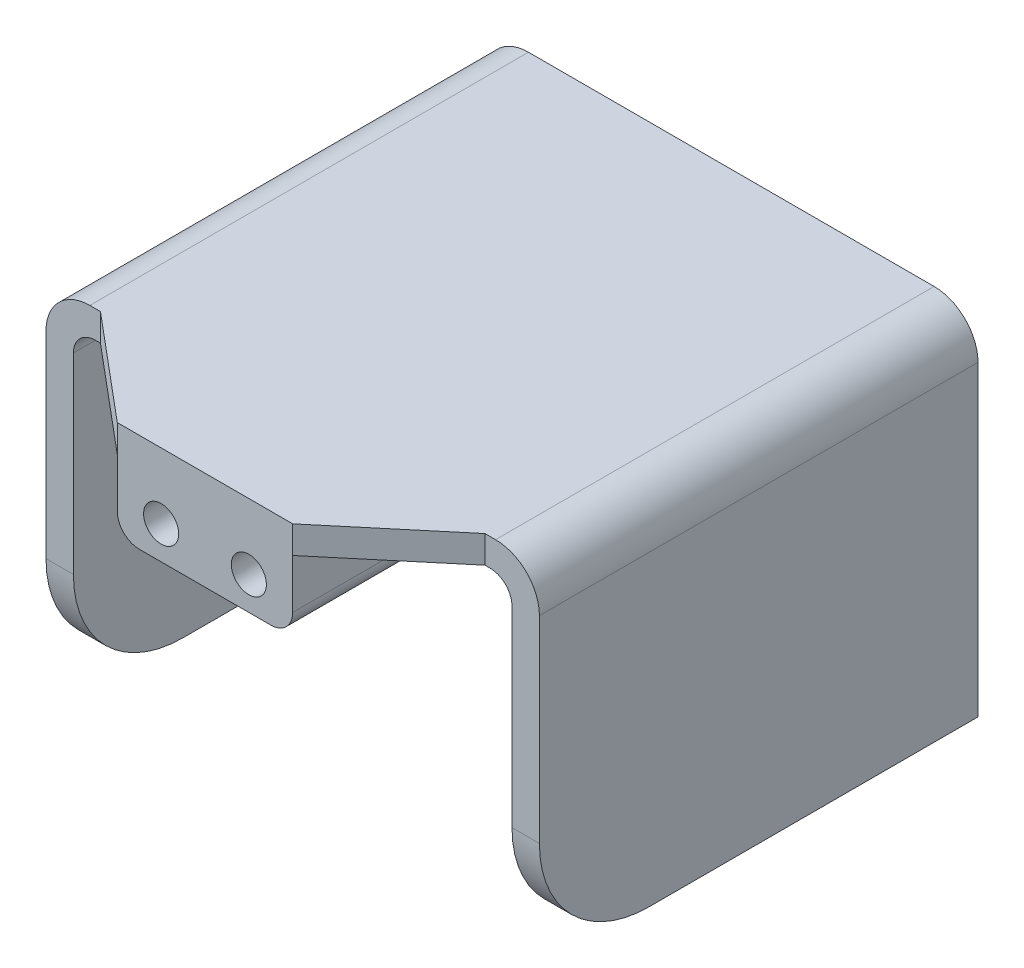
ISO-10303-21;
HEADER;
FILE_DESCRIPTION(('STEP AP214'),'2;1');
FILE_NAME('part.step','',(''),(''),'','','');
FILE_SCHEMA(('AUTOMOTIVE_DESIGN { 1 0 10303 214 1 1 1 1 }'));
ENDSEC;
DATA;
#1=APPLICATION_CONTEXT('core data for automotive mechanical design processes');
#2=APPLICATION_PROTOCOL_DEFINITION('international standard','automotive_design',2000,#1);
#3=PRODUCT_CONTEXT('',#1,'mechanical');
#4=PRODUCT('Part','Part','',(#3));
#5=PRODUCT_RELATED_PRODUCT_CATEGORY('part','',(#4));
#6=PRODUCT_DEFINITION_FORMATION('','',#4);
#7=PRODUCT_DEFINITION_CONTEXT('part definition',#1,'design');
#8=PRODUCT_DEFINITION('design','',#6,#7);
#9=PRODUCT_DEFINITION_SHAPE('','',#8);
#10=(LENGTH_UNIT() NAMED_UNIT(*) SI_UNIT(.MILLI.,.METRE.));
#11=(NAMED_UNIT(*) PLANE_ANGLE_UNIT() SI_UNIT($,.RADIAN.));
#12=(NAMED_UNIT(*) SI_UNIT($,.STERADIAN.) SOLID_ANGLE_UNIT());
#13=UNCERTAINTY_MEASURE_WITH_UNIT(LENGTH_MEASURE(1.E-05),#10,'distance_accuracy_value','');
#14=(GEOMETRIC_REPRESENTATION_CONTEXT(3) GLOBAL_UNCERTAINTY_ASSIGNED_CONTEXT((#13)) GLOBAL_UNIT_ASSIGNED_CONTEXT((#10,
#11,#12)) REPRESENTATION_CONTEXT('',''));
#15=CARTESIAN_POINT('',(0.,0.,0.));
#16=DIRECTION('',(0.,0.,1.));
#17=DIRECTION('',(1.,0.,0.));
#18=AXIS2_PLACEMENT_3D('',#15,#16,#17);
#19=CARTESIAN_POINT('',(-46.25,50.,0.));
#20=DIRECTION('',(0.,0.,1.));
#21=DIRECTION('',(1.,0.,0.));
#22=AXIS2_PLACEMENT_3D('',#19,#20,#21);
#23=PLANE('',#22);
#24=DIRECTION('',(1.,0.,0.));
#25=VECTOR('',#24,1.);
#26=CARTESIAN_POINT('',(50.,-20.,0.));
#27=LINE('',#26,#25);
#28=CARTESIAN_POINT('',(3.12499999999999,-20.,0.));
#29=VERTEX_POINT('',#28);
#30=CARTESIAN_POINT('',(56.25,-20.,0.));
#31=VERTEX_POINT('',#30);
#32=EDGE_CURVE('E218',#29,#31,#27,.T.);
#33=ORIENTED_EDGE('',*,*,#32,.F.);
#34=DIRECTION('',(0.,-1.,0.));
#35=VECTOR('',#34,1.);
#36=CARTESIAN_POINT('',(3.125,60.,0.));
#37=LINE('',#36,#35);
#38=CARTESIAN_POINT('',(3.125,60.,0.));
#39=VERTEX_POINT('',#38);
#40=EDGE_CURVE('E221',#39,#29,#37,.T.);
#41=ORIENTED_EDGE('',*,*,#40,.F.);
#42=DIRECTION('',(-1.,0.,0.));
#43=VECTOR('',#42,1.);
#44=CARTESIAN_POINT('',(46.25,60.,0.));
#45=LINE('',#44,#43);
#46=CARTESIAN_POINT('',(46.25,60.,0.));
#47=VERTEX_POINT('',#46);
#48=EDGE_CURVE('E352',#47,#39,#45,.T.);
#49=ORIENTED_EDGE('',*,*,#48,.F.);
#50=CARTESIAN_POINT('',(46.25,50.,0.));
#51=DIRECTION('',(0.,0.,1.));
#52=DIRECTION('',(-1.,0.,0.));
#53=AXIS2_PLACEMENT_3D('',#50,#51,#52);
#54=CIRCLE('',#53,10.);
#55=CARTESIAN_POINT('',(56.25,50.,0.));
#56=VERTEX_POINT('',#55);
#57=EDGE_CURVE('E348',#56,#47,#54,.T.);
#58=ORIENTED_EDGE('',*,*,#57,.F.);
#59=DIRECTION('',(0.,1.,0.));
#60=VECTOR('',#59,1.);
#61=CARTESIAN_POINT('',(56.25,-20.,0.));
#62=LINE('',#61,#60);
#63=EDGE_CURVE('E225',#31,#56,#62,.T.);
#64=ORIENTED_EDGE('',*,*,#63,.F.);
#65=EDGE_LOOP('',(#33,#41,#49,#58,#64));
#66=FACE_BOUND('',#65,.T.);
#67=ADVANCED_FACE('F41',(#66),#23,.F.);
#68=CARTESIAN_POINT('',(-46.25,50.,120.));
#69=DIRECTION('',(0.,0.,1.));
#70=DIRECTION('',(1.,0.,0.));
#71=AXIS2_PLACEMENT_3D('',#68,#69,#70);
#72=PLANE('',#71);
#73=DIRECTION('',(0.,1.,0.));
#74=VECTOR('',#73,1.);
#75=CARTESIAN_POINT('',(20.,-169.5,120.));
#76=LINE('',#75,#74);
#77=CARTESIAN_POINT('',(20.,53.75,120.));
#78=VERTEX_POINT('',#77);
#79=CARTESIAN_POINT('',(20.,60.,120.));
#80=VERTEX_POINT('',#79);
#81=EDGE_CURVE('E278',#78,#80,#76,.T.);
#82=ORIENTED_EDGE('',*,*,#81,.T.);
#83=DIRECTION('',(-1.,0.,0.));
#84=VECTOR('',#83,1.);
#85=CARTESIAN_POINT('',(46.25,60.,120.));
#86=LINE('',#85,#84);
#87=CARTESIAN_POINT('',(-20.,60.,120.));
#88=VERTEX_POINT('',#87);
#89=EDGE_CURVE('E340',#80,#88,#86,.T.);
#90=ORIENTED_EDGE('',*,*,#89,.T.);
#91=DIRECTION('',(0.,1.,0.));
#92=VECTOR('',#91,1.);
#93=CARTESIAN_POINT('',(-20.,-169.5,120.));
#94=LINE('',#93,#92);
#95=CARTESIAN_POINT('',(-20.,53.75,120.));
#96=VERTEX_POINT('',#95);
#97=EDGE_CURVE('E277',#96,#88,#94,.T.);
#98=ORIENTED_EDGE('',*,*,#97,.F.);
#99=DIRECTION('',(0.,-1.,0.));
#100=VECTOR('',#99,1.);
#101=CARTESIAN_POINT('',(-20.,53.75,120.));
#102=LINE('',#101,#100);
#103=CARTESIAN_POINT('',(-20.,42.5,120.));
#104=VERTEX_POINT('',#103);
#105=EDGE_CURVE('E328',#96,#104,#102,.T.);
#106=ORIENTED_EDGE('',*,*,#105,.T.);
#107=CARTESIAN_POINT('',(-15.,42.5,120.));
#108=DIRECTION('',(0.,0.,1.));
#109=DIRECTION('',(1.,0.,0.));
#110=AXIS2_PLACEMENT_3D('',#107,#108,#109);
#111=CIRCLE('',#110,5.);
#112=CARTESIAN_POINT('',(-15.,37.5,120.));
#113=VERTEX_POINT('',#112);
#114=EDGE_CURVE('E330',#104,#113,#111,.T.);
#115=ORIENTED_EDGE('',*,*,#114,.T.);
#116=DIRECTION('',(1.,0.,0.));
#117=VECTOR('',#116,1.);
#118=CARTESIAN_POINT('',(-15.,37.5,120.));
#119=LINE('',#118,#117);
#120=CARTESIAN_POINT('',(15.,37.5,120.));
#121=VERTEX_POINT('',#120);
#122=EDGE_CURVE('E333',#113,#121,#119,.T.);
#123=ORIENTED_EDGE('',*,*,#122,.T.);
#124=CARTESIAN_POINT('',(15.,42.5,120.));
#125=DIRECTION('',(0.,0.,1.));
#126=DIRECTION('',(-1.,0.,0.));
#127=AXIS2_PLACEMENT_3D('',#124,#125,#126);
#128=CIRCLE('',#127,5.);
#129=CARTESIAN_POINT('',(20.,42.5,120.));
#130=VERTEX_POINT('',#129);
#131=EDGE_CURVE('E335',#121,#130,#128,.T.);
#132=ORIENTED_EDGE('',*,*,#131,.T.);
#133=DIRECTION('',(0.,1.,0.));
#134=VECTOR('',#133,1.);
#135=CARTESIAN_POINT('',(20.,53.75,120.));
#136=LINE('',#135,#134);
#137=EDGE_CURVE('E337',#130,#78,#136,.T.);
#138=ORIENTED_EDGE('',*,*,#137,.T.);
#139=EDGE_LOOP('',(#82,#90,#98,#106,#115,#123,#132,#138));
#140=FACE_BOUND('',#139,.T.);
#141=CARTESIAN_POINT('',(10.,45.,120.));
#142=DIRECTION('',(0.,0.,1.));
#143=DIRECTION('',(-1.,0.,0.));
#144=AXIS2_PLACEMENT_3D('',#141,#142,#143);
#145=CIRCLE('',#144,4.00000000000001);
#146=CARTESIAN_POINT('',(5.99999999999999,45.,120.));
#147=VERTEX_POINT('',#146);
#148=EDGE_CURVE('E324',#147,#147,#145,.T.);
#149=ORIENTED_EDGE('',*,*,#148,.F.);
#150=EDGE_LOOP('',(#149));
#151=FACE_BOUND('',#150,.T.);
#152=CARTESIAN_POINT('',(-10.,45.,120.));
#153=DIRECTION('',(0.,0.,1.));
#154=DIRECTION('',(1.,0.,0.));
#155=AXIS2_PLACEMENT_3D('',#152,#153,#154);
#156=CIRCLE('',#155,4.00000000000001);
#157=CARTESIAN_POINT('',(-5.99999999999999,45.,120.));
#158=VERTEX_POINT('',#157);
#159=EDGE_CURVE('E321',#158,#158,#156,.T.);
#160=ORIENTED_EDGE('',*,*,#159,.F.);
#161=EDGE_LOOP('',(#160));
#162=FACE_BOUND('',#161,.T.);
#163=ADVANCED_FACE('F482',(#140,#151,#162),#72,.T.);
#164=DIRECTION('',(0.,-1.,0.));
#165=VECTOR('',#164,1.);
#166=CARTESIAN_POINT('',(-3.125,60.,0.));
#167=LINE('',#166,#165);
#168=CARTESIAN_POINT('',(-3.125,60.,0.));
#169=VERTEX_POINT('',#168);
#170=CARTESIAN_POINT('',(-3.125,-20.,0.));
#171=VERTEX_POINT('',#170);
#172=EDGE_CURVE('E265',#169,#171,#167,.T.);
#173=ORIENTED_EDGE('',*,*,#172,.T.);
#174=DIRECTION('',(1.,0.,0.));
#175=VECTOR('',#174,1.);
#176=CARTESIAN_POINT('',(-50.,-20.,0.));
#177=LINE('',#176,#175);
#178=CARTESIAN_POINT('',(-56.25,-20.,0.));
#179=VERTEX_POINT('',#178);
#180=EDGE_CURVE('E229',#179,#171,#177,.T.);
#181=ORIENTED_EDGE('',*,*,#180,.F.);
#182=DIRECTION('',(0.,-1.,0.));
#183=VECTOR('',#182,1.);
#184=CARTESIAN_POINT('',(-56.25,-20.,0.));
#185=LINE('',#184,#183);
#186=CARTESIAN_POINT('',(-56.25,50.,0.));
#187=VERTEX_POINT('',#186);
#188=EDGE_CURVE('E327',#187,#179,#185,.T.);
#189=ORIENTED_EDGE('',*,*,#188,.F.);
#190=CARTESIAN_POINT('',(-46.25,50.,0.));
#191=DIRECTION('',(0.,0.,1.));
#192=DIRECTION('',(1.,0.,0.));
#193=AXIS2_PLACEMENT_3D('',#190,#191,#192);
#194=CIRCLE('',#193,10.);
#195=CARTESIAN_POINT('',(-46.25,60.,0.));
#196=VERTEX_POINT('',#195);
#197=EDGE_CURVE('E331',#196,#187,#194,.T.);
#198=ORIENTED_EDGE('',*,*,#197,.F.);
#199=EDGE_CURVE('E351',#169,#196,#45,.T.);
#200=ORIENTED_EDGE('',*,*,#199,.F.);
#201=EDGE_LOOP('',(#173,#181,#189,#198,#200));
#202=FACE_BOUND('',#201,.T.);
#203=ADVANCED_FACE('F457',(#202),#23,.F.);
#204=CARTESIAN_POINT('',(-56.25,-20.,120.));
#205=DIRECTION('',(1.,0.,0.));
#206=DIRECTION('',(0.,0.,-1.));
#207=AXIS2_PLACEMENT_3D('',#204,#205,#206);
#208=PLANE('',#207);
#209=DIRECTION('',(0.,0.,-1.));
#210=VECTOR('',#209,1.);
#211=CARTESIAN_POINT('',(-56.25,-20.,120.));
#212=LINE('',#211,#210);
#213=CARTESIAN_POINT('',(-56.25,-20.,75.));
#214=VERTEX_POINT('',#213);
#215=EDGE_CURVE('E400',#214,#179,#212,.T.);
#216=ORIENTED_EDGE('',*,*,#215,.F.);
#217=CARTESIAN_POINT('',(-56.25,4.99999999999998,75.));
#218=DIRECTION('',(1.,0.,0.));
#219=DIRECTION('',(0.,0.,-1.));
#220=AXIS2_PLACEMENT_3D('',#217,#218,#219);
#221=CIRCLE('',#220,25.);
#222=CARTESIAN_POINT('',(-56.25,4.99999999999998,100.));
#223=VERTEX_POINT('',#222);
#224=EDGE_CURVE('E424',#214,#223,#221,.F.);
#225=ORIENTED_EDGE('',*,*,#224,.T.);
#226=DIRECTION('',(0.,1.,0.));
#227=VECTOR('',#226,1.);
#228=CARTESIAN_POINT('',(-56.25,-169.5,100.));
#229=LINE('',#228,#227);
#230=CARTESIAN_POINT('',(-56.25,50.,100.));
#231=VERTEX_POINT('',#230);
#232=EDGE_CURVE('E287',#223,#231,#229,.T.);
#233=ORIENTED_EDGE('',*,*,#232,.T.);
#234=DIRECTION('',(0.,0.,-1.));
#235=VECTOR('',#234,1.);
#236=CARTESIAN_POINT('',(-56.25,50.,120.));
#237=LINE('',#236,#235);
#238=EDGE_CURVE('E343',#231,#187,#237,.T.);
#239=ORIENTED_EDGE('',*,*,#238,.T.);
#240=ORIENTED_EDGE('',*,*,#188,.T.);
#241=EDGE_LOOP('',(#216,#225,#233,#239,#240));
#242=FACE_BOUND('',#241,.T.);
#243=ADVANCED_FACE('F446',(#242),#208,.F.);
#244=CARTESIAN_POINT('',(-50.,48.75,120.));
#245=DIRECTION('',(-1.,0.,0.));
#246=DIRECTION('',(0.,-1.,0.));
#247=AXIS2_PLACEMENT_3D('',#244,#245,#246);
#248=PLANE('',#247);
#249=DIRECTION('',(0.,-1.,0.));
#250=VECTOR('',#249,1.);
#251=CARTESIAN_POINT('',(-50.,48.75,100.));
#252=LINE('',#251,#250);
#253=CARTESIAN_POINT('',(-50.,48.75,100.));
#254=VERTEX_POINT('',#253);
#255=CARTESIAN_POINT('',(-50.,4.99999999999998,100.));
#256=VERTEX_POINT('',#255);
#257=EDGE_CURVE('E301',#254,#256,#252,.T.);
#258=ORIENTED_EDGE('',*,*,#257,.T.);
#259=CARTESIAN_POINT('',(-50.,4.99999999999998,75.));
#260=DIRECTION('',(-1.,0.,0.));
#261=DIRECTION('',(0.,-1.,0.));
#262=AXIS2_PLACEMENT_3D('',#259,#260,#261);
#263=CIRCLE('',#262,25.);
#264=CARTESIAN_POINT('',(-50.,-20.,75.));
#265=VERTEX_POINT('',#264);
#266=EDGE_CURVE('E428',#256,#265,#263,.F.);
#267=ORIENTED_EDGE('',*,*,#266,.T.);
#268=DIRECTION('',(0.,0.,-1.));
#269=VECTOR('',#268,1.);
#270=CARTESIAN_POINT('',(-50.,-20.,120.));
#271=LINE('',#270,#269);
#272=CARTESIAN_POINT('',(-50.,-20.0000000000001,6.25));
#273=VERTEX_POINT('',#272);
#274=EDGE_CURVE('E398',#265,#273,#271,.T.);
#275=ORIENTED_EDGE('',*,*,#274,.T.);
#276=DIRECTION('',(0.,1.,0.));
#277=VECTOR('',#276,1.);
#278=CARTESIAN_POINT('',(-50.,48.75,6.25000000000001));
#279=LINE('',#278,#277);
#280=CARTESIAN_POINT('',(-50.,48.75,6.25000000000001));
#281=VERTEX_POINT('',#280);
#282=EDGE_CURVE('E520',#273,#281,#279,.T.);
#283=ORIENTED_EDGE('',*,*,#282,.T.);
#284=DIRECTION('',(0.,0.,-1.));
#285=VECTOR('',#284,1.);
#286=CARTESIAN_POINT('',(-50.,48.75,120.));
#287=LINE('',#286,#285);
#288=EDGE_CURVE('E395',#254,#281,#287,.T.);
#289=ORIENTED_EDGE('',*,*,#288,.F.);
#290=EDGE_LOOP('',(#258,#267,#275,#283,#289));
#291=FACE_BOUND('',#290,.T.);
#292=ADVANCED_FACE('F432',(#291),#248,.F.);
#293=CARTESIAN_POINT('',(-45.,48.75,120.));
#294=DIRECTION('',(0.,0.,-1.));
#295=DIRECTION('',(-1.,0.,0.));
#296=AXIS2_PLACEMENT_3D('',#293,#294,#295);
#297=CYLINDRICAL_SURFACE('',#296,4.99999999999999);
#298=ORIENTED_EDGE('',*,*,#288,.T.);
#299=CARTESIAN_POINT('',(-45.,48.75,6.25000000000001));
#300=DIRECTION('',(0.,0.,1.));
#301=DIRECTION('',(1.,0.,0.));
#302=AXIS2_PLACEMENT_3D('',#299,#300,#301);
#303=CIRCLE('',#302,4.99999999999999);
#304=CARTESIAN_POINT('',(-45.,53.75,6.25));
#305=VERTEX_POINT('',#304);
#306=EDGE_CURVE('E523',#281,#305,#303,.F.);
#307=ORIENTED_EDGE('',*,*,#306,.T.);
#308=DIRECTION('',(0.,0.,-1.));
#309=VECTOR('',#308,1.);
#310=CARTESIAN_POINT('',(-45.,53.75,120.));
#311=LINE('',#310,#309);
#312=CARTESIAN_POINT('',(-45.,53.75,100.));
#313=VERTEX_POINT('',#312);
#314=EDGE_CURVE('E392',#313,#305,#311,.T.);
#315=ORIENTED_EDGE('',*,*,#314,.F.);
#316=CARTESIAN_POINT('',(-45.,48.75,100.));
#317=DIRECTION('',(0.,0.,-1.));
#318=DIRECTION('',(-1.,0.,0.));
#319=AXIS2_PLACEMENT_3D('',#316,#317,#318);
#320=CIRCLE('',#319,4.99999999999999);
#321=EDGE_CURVE('E298',#313,#254,#320,.F.);
#322=ORIENTED_EDGE('',*,*,#321,.T.);
#323=EDGE_LOOP('',(#298,#307,#315,#322));
#324=FACE_BOUND('',#323,.T.);
#325=ADVANCED_FACE('F498',(#324),#297,.F.);
#326=CARTESIAN_POINT('',(-45.,53.75,120.));
#327=DIRECTION('',(0.,1.,0.));
#328=DIRECTION('',(-1.,0.,0.));
#329=AXIS2_PLACEMENT_3D('',#326,#327,#328);
#330=PLANE('',#329);
#331=ORIENTED_EDGE('',*,*,#314,.T.);
#332=DIRECTION('',(-1.,0.,0.));
#333=VECTOR('',#332,1.);
#334=CARTESIAN_POINT('',(-53.3439178125602,53.75,6.25));
#335=LINE('',#334,#333);
#336=CARTESIAN_POINT('',(-20.,53.75,6.25));
#337=VERTEX_POINT('',#336);
#338=EDGE_CURVE('E578',#337,#305,#335,.T.);
#339=ORIENTED_EDGE('',*,*,#338,.F.);
#340=DIRECTION('',(0.,0.,-1.));
#341=VECTOR('',#340,1.);
#342=CARTESIAN_POINT('',(-20.,53.75,120.));
#343=LINE('',#342,#341);
#344=EDGE_CURVE('E389',#96,#337,#343,.T.);
#345=ORIENTED_EDGE('',*,*,#344,.F.);
#346=DIRECTION('',(-0.766044443118977,0.,-0.642787609686541));
#347=VECTOR('',#346,1.);
#348=CARTESIAN_POINT('',(-34.6706022208366,53.75,107.689903087347));
#349=LINE('',#348,#347);
#350=CARTESIAN_POINT('',(-43.8350718518841,53.75,100.));
#351=VERTEX_POINT('',#350);
#352=EDGE_CURVE('E304',#96,#351,#349,.T.);
#353=ORIENTED_EDGE('',*,*,#352,.T.);
#354=DIRECTION('',(-1.,0.,0.));
#355=VECTOR('',#354,1.);
#356=CARTESIAN_POINT('',(-45.,53.75,100.));
#357=LINE('',#356,#355);
#358=EDGE_CURVE('E295',#351,#313,#357,.T.);
#359=ORIENTED_EDGE('',*,*,#358,.T.);
#360=EDGE_LOOP('',(#331,#339,#345,#353,#359));
#361=FACE_BOUND('',#360,.T.);
#362=ADVANCED_FACE('F613',(#361),#330,.F.);
#363=CARTESIAN_POINT('',(-20.,53.75,120.));
#364=DIRECTION('',(1.,0.,0.));
#365=DIRECTION('',(0.,0.,-1.));
#366=AXIS2_PLACEMENT_3D('',#363,#364,#365);
#367=PLANE('',#366);
#368=ORIENTED_EDGE('',*,*,#344,.T.);
#369=DIRECTION('',(0.,-1.,0.));
#370=VECTOR('',#369,1.);
#371=CARTESIAN_POINT('',(-20.,53.75,6.25000000000001));
#372=LINE('',#371,#370);
#373=CARTESIAN_POINT('',(-20.,42.5,6.25000000000001));
#374=VERTEX_POINT('',#373);
#375=EDGE_CURVE('E528',#337,#374,#372,.T.);
#376=ORIENTED_EDGE('',*,*,#375,.T.);
#377=DIRECTION('',(0.,0.,-1.));
#378=VECTOR('',#377,1.);
#379=CARTESIAN_POINT('',(-20.,42.5,120.));
#380=LINE('',#379,#378);
#381=EDGE_CURVE('E386',#104,#374,#380,.T.);
#382=ORIENTED_EDGE('',*,*,#381,.F.);
#383=ORIENTED_EDGE('',*,*,#105,.F.);
#384=EDGE_LOOP('',(#368,#376,#382,#383));
#385=FACE_BOUND('',#384,.T.);
#386=ADVANCED_FACE('F600',(#385),#367,.F.);
#387=CARTESIAN_POINT('',(-15.,42.5,120.));
#388=DIRECTION('',(0.,0.,-1.));
#389=DIRECTION('',(-1.,0.,0.));
#390=AXIS2_PLACEMENT_3D('',#387,#388,#389);
#391=CYLINDRICAL_SURFACE('',#390,5.);
#392=ORIENTED_EDGE('',*,*,#381,.T.);
#393=CARTESIAN_POINT('',(-15.,42.5,6.25000000000001));
#394=DIRECTION('',(0.,0.,1.));
#395=DIRECTION('',(1.,0.,0.));
#396=AXIS2_PLACEMENT_3D('',#393,#394,#395);
#397=CIRCLE('',#396,5.);
#398=CARTESIAN_POINT('',(-15.,37.5,6.25000000000001));
#399=VERTEX_POINT('',#398);
#400=EDGE_CURVE('E595',#374,#399,#397,.T.);
#401=ORIENTED_EDGE('',*,*,#400,.T.);
#402=DIRECTION('',(0.,0.,-1.));
#403=VECTOR('',#402,1.);
#404=CARTESIAN_POINT('',(-15.,37.5,120.));
#405=LINE('',#404,#403);
#406=EDGE_CURVE('E383',#113,#399,#405,.T.);
#407=ORIENTED_EDGE('',*,*,#406,.F.);
#408=ORIENTED_EDGE('',*,*,#114,.F.);
#409=EDGE_LOOP('',(#392,#401,#407,#408));
#410=FACE_BOUND('',#409,.T.);
#411=ADVANCED_FACE('F606',(#410),#391,.T.);
#412=CARTESIAN_POINT('',(-15.,37.5,120.));
#413=DIRECTION('',(0.,1.,0.));
#414=DIRECTION('',(0.,0.,1.));
#415=AXIS2_PLACEMENT_3D('',#412,#413,#414);
#416=PLANE('',#415);
#417=ORIENTED_EDGE('',*,*,#406,.T.);
#418=DIRECTION('',(1.,0.,0.));
#419=VECTOR('',#418,1.);
#420=CARTESIAN_POINT('',(-15.,37.5,6.25000000000001));
#421=LINE('',#420,#419);
#422=CARTESIAN_POINT('',(15.,37.5,6.25000000000001));
#423=VERTEX_POINT('',#422);
#424=EDGE_CURVE('E592',#399,#423,#421,.T.);
#425=ORIENTED_EDGE('',*,*,#424,.T.);
#426=DIRECTION('',(0.,0.,-1.));
#427=VECTOR('',#426,1.);
#428=CARTESIAN_POINT('',(15.,37.5,120.));
#429=LINE('',#428,#427);
#430=EDGE_CURVE('E380',#121,#423,#429,.T.);
#431=ORIENTED_EDGE('',*,*,#430,.F.);
#432=ORIENTED_EDGE('',*,*,#122,.F.);
#433=EDGE_LOOP('',(#417,#425,#431,#432));
#434=FACE_BOUND('',#433,.T.);
#435=ADVANCED_FACE('F629',(#434),#416,.F.);
#436=CARTESIAN_POINT('',(15.,42.5,120.));
#437=DIRECTION('',(0.,0.,-1.));
#438=DIRECTION('',(-1.,0.,0.));
#439=AXIS2_PLACEMENT_3D('',#436,#437,#438);
#440=CYLINDRICAL_SURFACE('',#439,5.);
#441=ORIENTED_EDGE('',*,*,#430,.T.);
#442=CARTESIAN_POINT('',(15.,42.5,6.25000000000001));
#443=DIRECTION('',(0.,0.,1.));
#444=DIRECTION('',(1.,0.,0.));
#445=AXIS2_PLACEMENT_3D('',#442,#443,#444);
#446=CIRCLE('',#445,5.);
#447=CARTESIAN_POINT('',(20.,42.5,6.25000000000001));
#448=VERTEX_POINT('',#447);
#449=EDGE_CURVE('E589',#423,#448,#446,.T.);
#450=ORIENTED_EDGE('',*,*,#449,.T.);
#451=DIRECTION('',(0.,0.,-1.));
#452=VECTOR('',#451,1.);
#453=CARTESIAN_POINT('',(20.,42.5,120.));
#454=LINE('',#453,#452);
#455=EDGE_CURVE('E377',#130,#448,#454,.T.);
#456=ORIENTED_EDGE('',*,*,#455,.F.);
#457=ORIENTED_EDGE('',*,*,#131,.F.);
#458=EDGE_LOOP('',(#441,#450,#456,#457));
#459=FACE_BOUND('',#458,.T.);
#460=ADVANCED_FACE('F627',(#459),#440,.T.);
#461=CARTESIAN_POINT('',(20.,53.75,120.));
#462=DIRECTION('',(-1.,0.,0.));
#463=DIRECTION('',(0.,0.,1.));
#464=AXIS2_PLACEMENT_3D('',#461,#462,#463);
#465=PLANE('',#464);
#466=ORIENTED_EDGE('',*,*,#455,.T.);
#467=DIRECTION('',(0.,1.,0.));
#468=VECTOR('',#467,1.);
#469=CARTESIAN_POINT('',(20.,53.75,6.25000000000001));
#470=LINE('',#469,#468);
#471=CARTESIAN_POINT('',(20.,53.75,6.25));
#472=VERTEX_POINT('',#471);
#473=EDGE_CURVE('E586',#448,#472,#470,.T.);
#474=ORIENTED_EDGE('',*,*,#473,.T.);
#475=DIRECTION('',(0.,0.,-1.));
#476=VECTOR('',#475,1.);
#477=CARTESIAN_POINT('',(20.,53.75,120.));
#478=LINE('',#477,#476);
#479=EDGE_CURVE('E374',#78,#472,#478,.T.);
#480=ORIENTED_EDGE('',*,*,#479,.F.);
#481=ORIENTED_EDGE('',*,*,#137,.F.);
#482=EDGE_LOOP('',(#466,#474,#480,#481));
#483=FACE_BOUND('',#482,.T.);
#484=ADVANCED_FACE('F620',(#483),#465,.F.);
#485=CARTESIAN_POINT('',(45.,53.75,120.));
#486=DIRECTION('',(0.,1.,0.));
#487=DIRECTION('',(-1.,0.,0.));
#488=AXIS2_PLACEMENT_3D('',#485,#486,#487);
#489=PLANE('',#488);
#490=ORIENTED_EDGE('',*,*,#479,.T.);
#491=CARTESIAN_POINT('',(45.,53.75,6.25000000000001));
#492=VERTEX_POINT('',#491);
#493=EDGE_CURVE('E583',#492,#472,#335,.T.);
#494=ORIENTED_EDGE('',*,*,#493,.F.);
#495=DIRECTION('',(0.,0.,-1.));
#496=VECTOR('',#495,1.);
#497=CARTESIAN_POINT('',(45.,53.75,120.));
#498=LINE('',#497,#496);
#499=CARTESIAN_POINT('',(45.,53.75,100.));
#500=VERTEX_POINT('',#499);
#501=EDGE_CURVE('E371',#500,#492,#498,.T.);
#502=ORIENTED_EDGE('',*,*,#501,.F.);
#503=DIRECTION('',(-1.,0.,0.));
#504=VECTOR('',#503,1.);
#505=CARTESIAN_POINT('',(45.,53.75,100.));
#506=LINE('',#505,#504);
#507=CARTESIAN_POINT('',(43.8350718518842,53.75,100.));
#508=VERTEX_POINT('',#507);
#509=EDGE_CURVE('E315',#500,#508,#506,.T.);
#510=ORIENTED_EDGE('',*,*,#509,.T.);
#511=DIRECTION('',(-0.766044443118977,0.,0.642787609686541));
#512=VECTOR('',#511,1.);
#513=CARTESIAN_POINT('',(34.6706022208366,53.75,107.689903087347));
#514=LINE('',#513,#512);
#515=EDGE_CURVE('E318',#508,#78,#514,.T.);
#516=ORIENTED_EDGE('',*,*,#515,.T.);
#517=EDGE_LOOP('',(#490,#494,#502,#510,#516));
#518=FACE_BOUND('',#517,.T.);
#519=ADVANCED_FACE('F623',(#518),#489,.F.);
#520=CARTESIAN_POINT('',(45.,48.75,120.));
#521=DIRECTION('',(0.,0.,-1.));
#522=DIRECTION('',(-1.,0.,0.));
#523=AXIS2_PLACEMENT_3D('',#520,#521,#522);
#524=CYLINDRICAL_SURFACE('',#523,4.99999999999999);
#525=ORIENTED_EDGE('',*,*,#501,.T.);
#526=CARTESIAN_POINT('',(45.,48.75,6.25000000000001));
#527=DIRECTION('',(0.,0.,1.));
#528=DIRECTION('',(1.,0.,0.));
#529=AXIS2_PLACEMENT_3D('',#526,#527,#528);
#530=CIRCLE('',#529,4.99999999999999);
#531=CARTESIAN_POINT('',(50.,48.75,6.25000000000001));
#532=VERTEX_POINT('',#531);
#533=EDGE_CURVE('E582',#492,#532,#530,.F.);
#534=ORIENTED_EDGE('',*,*,#533,.T.);
#535=DIRECTION('',(0.,0.,-1.));
#536=VECTOR('',#535,1.);
#537=CARTESIAN_POINT('',(50.,48.75,120.));
#538=LINE('',#537,#536);
#539=CARTESIAN_POINT('',(50.,48.75,100.));
#540=VERTEX_POINT('',#539);
#541=EDGE_CURVE('E368',#540,#532,#538,.T.);
#542=ORIENTED_EDGE('',*,*,#541,.F.);
#543=CARTESIAN_POINT('',(45.,48.75,100.));
#544=DIRECTION('',(0.,0.,-1.));
#545=DIRECTION('',(-1.,0.,0.));
#546=AXIS2_PLACEMENT_3D('',#543,#544,#545);
#547=CIRCLE('',#546,4.99999999999999);
#548=EDGE_CURVE('E312',#540,#500,#547,.F.);
#549=ORIENTED_EDGE('',*,*,#548,.T.);
#550=EDGE_LOOP('',(#525,#534,#542,#549));
#551=FACE_BOUND('',#550,.T.);
#552=ADVANCED_FACE('F660',(#551),#524,.F.);
#553=CARTESIAN_POINT('',(50.,48.75,120.));
#554=DIRECTION('',(1.,0.,0.));
#555=DIRECTION('',(0.,1.,0.));
#556=AXIS2_PLACEMENT_3D('',#553,#554,#555);
#557=PLANE('',#556);
#558=DIRECTION('',(0.,0.,-1.));
#559=VECTOR('',#558,1.);
#560=CARTESIAN_POINT('',(50.,-20.,120.));
#561=LINE('',#560,#559);
#562=CARTESIAN_POINT('',(50.,-20.,75.));
#563=VERTEX_POINT('',#562);
#564=CARTESIAN_POINT('',(50.,-20.,6.25000000000001));
#565=VERTEX_POINT('',#564);
#566=EDGE_CURVE('E366',#563,#565,#561,.T.);
#567=ORIENTED_EDGE('',*,*,#566,.F.);
#568=CARTESIAN_POINT('',(50.,4.99999999999998,75.));
#569=DIRECTION('',(1.,0.,0.));
#570=DIRECTION('',(0.,1.,0.));
#571=AXIS2_PLACEMENT_3D('',#568,#569,#570);
#572=CIRCLE('',#571,25.);
#573=CARTESIAN_POINT('',(50.,4.99999999999998,100.));
#574=VERTEX_POINT('',#573);
#575=EDGE_CURVE('E63',#563,#574,#572,.F.);
#576=ORIENTED_EDGE('',*,*,#575,.T.);
#577=DIRECTION('',(0.,1.,0.));
#578=VECTOR('',#577,1.);
#579=CARTESIAN_POINT('',(50.,48.75,100.));
#580=LINE('',#579,#578);
#581=EDGE_CURVE('E310',#574,#540,#580,.T.);
#582=ORIENTED_EDGE('',*,*,#581,.T.);
#583=ORIENTED_EDGE('',*,*,#541,.T.);
#584=DIRECTION('',(0.,-1.,0.));
#585=VECTOR('',#584,1.);
#586=CARTESIAN_POINT('',(50.,48.75,6.25000000000001));
#587=LINE('',#586,#585);
#588=EDGE_CURVE('E580',#532,#565,#587,.T.);
#589=ORIENTED_EDGE('',*,*,#588,.T.);
#590=EDGE_LOOP('',(#567,#576,#582,#583,#589));
#591=FACE_BOUND('',#590,.T.);
#592=ADVANCED_FACE('F657',(#591),#557,.F.);
#593=CARTESIAN_POINT('',(50.,-20.,120.));
#594=DIRECTION('',(0.,1.,0.));
#595=DIRECTION('',(0.,0.,1.));
#596=AXIS2_PLACEMENT_3D('',#593,#594,#595);
#597=PLANE('',#596);
#598=ORIENTED_EDGE('',*,*,#274,.F.);
#599=DIRECTION('',(-1.,0.,0.));
#600=VECTOR('',#599,1.);
#601=CARTESIAN_POINT('',(50.,-20.,75.));
#602=LINE('',#601,#600);
#603=EDGE_CURVE('E421',#265,#214,#602,.T.);
#604=ORIENTED_EDGE('',*,*,#603,.T.);
#605=ORIENTED_EDGE('',*,*,#215,.T.);
#606=ORIENTED_EDGE('',*,*,#180,.T.);
#607=DIRECTION('',(-1.,0.,0.));
#608=VECTOR('',#607,1.);
#609=CARTESIAN_POINT('',(3.125,-20.,0.));
#610=LINE('',#609,#608);
#611=EDGE_CURVE('E243',#29,#171,#610,.T.);
#612=ORIENTED_EDGE('',*,*,#611,.F.);
#613=ORIENTED_EDGE('',*,*,#32,.T.);
#614=DIRECTION('',(0.,0.,-1.));
#615=VECTOR('',#614,1.);
#616=CARTESIAN_POINT('',(56.25,-20.,120.));
#617=LINE('',#616,#615);
#618=CARTESIAN_POINT('',(56.25,-20.,75.));
#619=VERTEX_POINT('',#618);
#620=EDGE_CURVE('E364',#619,#31,#617,.T.);
#621=ORIENTED_EDGE('',*,*,#620,.F.);
#622=DIRECTION('',(-1.,0.,0.));
#623=VECTOR('',#622,1.);
#624=CARTESIAN_POINT('',(50.,-20.,75.));
#625=LINE('',#624,#623);
#626=EDGE_CURVE('E418',#619,#563,#625,.T.);
#627=ORIENTED_EDGE('',*,*,#626,.T.);
#628=ORIENTED_EDGE('',*,*,#566,.T.);
#629=DIRECTION('',(-1.,0.,0.));
#630=VECTOR('',#629,1.);
#631=CARTESIAN_POINT('',(-53.34391781256,-20.0000000000001,6.25));
#632=LINE('',#631,#630);
#633=EDGE_CURVE('E442',#565,#273,#632,.T.);
#634=ORIENTED_EDGE('',*,*,#633,.T.);
#635=EDGE_LOOP('',(#598,#604,#605,#606,#612,#613,#621,#627,#628,#634));
#636=FACE_BOUND('',#635,.T.);
#637=ADVANCED_FACE('F245',(#636),#597,.F.);
#638=CARTESIAN_POINT('',(56.25,-20.,120.));
#639=DIRECTION('',(-1.,0.,0.));
#640=DIRECTION('',(0.,0.,1.));
#641=AXIS2_PLACEMENT_3D('',#638,#639,#640);
#642=PLANE('',#641);
#643=DIRECTION('',(0.,1.,0.));
#644=VECTOR('',#643,1.);
#645=CARTESIAN_POINT('',(56.25,-169.5,100.));
#646=LINE('',#645,#644);
#647=CARTESIAN_POINT('',(56.25,4.99999999999998,100.));
#648=VERTEX_POINT('',#647);
#649=CARTESIAN_POINT('',(56.25,50.,100.));
#650=VERTEX_POINT('',#649);
#651=EDGE_CURVE('E285',#648,#650,#646,.T.);
#652=ORIENTED_EDGE('',*,*,#651,.F.);
#653=CARTESIAN_POINT('',(56.25,4.99999999999998,75.));
#654=DIRECTION('',(-1.,0.,0.));
#655=DIRECTION('',(0.,0.,1.));
#656=AXIS2_PLACEMENT_3D('',#653,#654,#655);
#657=CIRCLE('',#656,25.);
#658=EDGE_CURVE('E11',#648,#619,#657,.F.);
#659=ORIENTED_EDGE('',*,*,#658,.T.);
#660=ORIENTED_EDGE('',*,*,#620,.T.);
#661=ORIENTED_EDGE('',*,*,#63,.T.);
#662=DIRECTION('',(0.,0.,-1.));
#663=VECTOR('',#662,1.);
#664=CARTESIAN_POINT('',(56.25,50.,120.));
#665=LINE('',#664,#663);
#666=EDGE_CURVE('E362',#650,#56,#665,.T.);
#667=ORIENTED_EDGE('',*,*,#666,.F.);
#668=EDGE_LOOP('',(#652,#659,#660,#661,#667));
#669=FACE_BOUND('',#668,.T.);
#670=ADVANCED_FACE('F654',(#669),#642,.F.);
#671=CARTESIAN_POINT('',(46.25,50.,120.));
#672=DIRECTION('',(0.,0.,-1.));
#673=DIRECTION('',(-1.,0.,0.));
#674=AXIS2_PLACEMENT_3D('',#671,#672,#673);
#675=CYLINDRICAL_SURFACE('',#674,10.);
#676=DIRECTION('',(0.,0.,-1.));
#677=VECTOR('',#676,1.);
#678=CARTESIAN_POINT('',(46.25,60.,120.));
#679=LINE('',#678,#677);
#680=CARTESIAN_POINT('',(46.25,60.,100.));
#681=VERTEX_POINT('',#680);
#682=EDGE_CURVE('E360',#681,#47,#679,.T.);
#683=ORIENTED_EDGE('',*,*,#682,.F.);
#684=CARTESIAN_POINT('',(46.25,50.,100.));
#685=DIRECTION('',(0.,0.,-1.));
#686=DIRECTION('',(-1.,0.,0.));
#687=AXIS2_PLACEMENT_3D('',#684,#685,#686);
#688=CIRCLE('',#687,10.);
#689=EDGE_CURVE('E307',#681,#650,#688,.T.);
#690=ORIENTED_EDGE('',*,*,#689,.T.);
#691=ORIENTED_EDGE('',*,*,#666,.T.);
#692=ORIENTED_EDGE('',*,*,#57,.T.);
#693=EDGE_LOOP('',(#683,#690,#691,#692));
#694=FACE_BOUND('',#693,.T.);
#695=ADVANCED_FACE('F651',(#694),#675,.T.);
#696=CARTESIAN_POINT('',(46.25,60.,120.));
#697=DIRECTION('',(0.,-1.,0.));
#698=DIRECTION('',(0.,0.,-1.));
#699=AXIS2_PLACEMENT_3D('',#696,#697,#698);
#700=PLANE('',#699);
#701=ORIENTED_EDGE('',*,*,#89,.F.);
#702=DIRECTION('',(0.766044443118977,0.,-0.642787609686541));
#703=VECTOR('',#702,1.);
#704=CARTESIAN_POINT('',(35.4041323318784,60.,107.074398241715));
#705=LINE('',#704,#703);
#706=CARTESIAN_POINT('',(43.8350718518842,60.,100.));
#707=VERTEX_POINT('',#706);
#708=EDGE_CURVE('E411',#80,#707,#705,.T.);
#709=ORIENTED_EDGE('',*,*,#708,.T.);
#710=DIRECTION('',(1.,0.,0.));
#711=VECTOR('',#710,1.);
#712=CARTESIAN_POINT('',(46.25,60.,100.));
#713=LINE('',#712,#711);
#714=EDGE_CURVE('E408',#707,#681,#713,.T.);
#715=ORIENTED_EDGE('',*,*,#714,.T.);
#716=ORIENTED_EDGE('',*,*,#682,.T.);
#717=ORIENTED_EDGE('',*,*,#48,.T.);
#718=DIRECTION('',(-1.,0.,0.));
#719=VECTOR('',#718,1.);
#720=CARTESIAN_POINT('',(3.125,60.,0.));
#721=LINE('',#720,#719);
#722=EDGE_CURVE('E250',#39,#169,#721,.T.);
#723=ORIENTED_EDGE('',*,*,#722,.T.);
#724=ORIENTED_EDGE('',*,*,#199,.T.);
#725=DIRECTION('',(0.,0.,-1.));
#726=VECTOR('',#725,1.);
#727=CARTESIAN_POINT('',(-46.25,60.,120.));
#728=LINE('',#727,#726);
#729=CARTESIAN_POINT('',(-46.25,60.,100.));
#730=VERTEX_POINT('',#729);
#731=EDGE_CURVE('E357',#730,#196,#728,.T.);
#732=ORIENTED_EDGE('',*,*,#731,.F.);
#733=DIRECTION('',(1.,0.,0.));
#734=VECTOR('',#733,1.);
#735=CARTESIAN_POINT('',(46.25,60.,100.));
#736=LINE('',#735,#734);
#737=CARTESIAN_POINT('',(-43.8350718518841,60.,100.));
#738=VERTEX_POINT('',#737);
#739=EDGE_CURVE('E281',#730,#738,#736,.T.);
#740=ORIENTED_EDGE('',*,*,#739,.T.);
#741=DIRECTION('',(0.766044443118977,0.,0.642787609686541));
#742=VECTOR('',#741,1.);
#743=CARTESIAN_POINT('',(18.877095885217,60.,152.621756818529));
#744=LINE('',#743,#742);
#745=EDGE_CURVE('E405',#738,#88,#744,.T.);
#746=ORIENTED_EDGE('',*,*,#745,.T.);
#747=EDGE_LOOP('',(#701,#709,#715,#716,#717,#723,#724,#732,#740,#746));
#748=FACE_BOUND('',#747,.T.);
#749=ADVANCED_FACE('F567',(#748),#700,.F.);
#750=CARTESIAN_POINT('',(-46.25,50.,120.));
#751=DIRECTION('',(0.,0.,-1.));
#752=DIRECTION('',(-1.,0.,0.));
#753=AXIS2_PLACEMENT_3D('',#750,#751,#752);
#754=CYLINDRICAL_SURFACE('',#753,10.);
#755=ORIENTED_EDGE('',*,*,#238,.F.);
#756=CARTESIAN_POINT('',(-46.25,50.,100.));
#757=DIRECTION('',(0.,0.,-1.));
#758=DIRECTION('',(-1.,0.,0.));
#759=AXIS2_PLACEMENT_3D('',#756,#757,#758);
#760=CIRCLE('',#759,10.);
#761=EDGE_CURVE('E402',#231,#730,#760,.T.);
#762=ORIENTED_EDGE('',*,*,#761,.T.);
#763=ORIENTED_EDGE('',*,*,#731,.T.);
#764=ORIENTED_EDGE('',*,*,#197,.T.);
#765=EDGE_LOOP('',(#755,#762,#763,#764));
#766=FACE_BOUND('',#765,.T.);
#767=ADVANCED_FACE('F453',(#766),#754,.T.);
#768=CARTESIAN_POINT('',(10.,45.,120.));
#769=DIRECTION('',(0.,0.,-1.));
#770=DIRECTION('',(-1.,0.,0.));
#771=AXIS2_PLACEMENT_3D('',#768,#769,#770);
#772=CYLINDRICAL_SURFACE('',#771,4.00000000000001);
#773=CARTESIAN_POINT('',(10.,45.,6.25000000000001));
#774=DIRECTION('',(0.,0.,1.));
#775=DIRECTION('',(1.,0.,0.));
#776=AXIS2_PLACEMENT_3D('',#773,#774,#775);
#777=CIRCLE('',#776,4.00000000000001);
#778=CARTESIAN_POINT('',(14.,45.,6.25000000000001));
#779=VERTEX_POINT('',#778);
#780=EDGE_CURVE('E417',#779,#779,#777,.T.);
#781=ORIENTED_EDGE('',*,*,#780,.F.);
#782=EDGE_LOOP('',(#781));
#783=FACE_BOUND('',#782,.T.);
#784=ORIENTED_EDGE('',*,*,#148,.T.);
#785=EDGE_LOOP('',(#784));
#786=FACE_BOUND('',#785,.T.);
#787=ADVANCED_FACE('F560',(#783,#786),#772,.F.);
#788=CARTESIAN_POINT('',(-10.,45.,120.));
#789=DIRECTION('',(0.,0.,-1.));
#790=DIRECTION('',(-1.,0.,0.));
#791=AXIS2_PLACEMENT_3D('',#788,#789,#790);
#792=CYLINDRICAL_SURFACE('',#791,4.00000000000001);
#793=CARTESIAN_POINT('',(-10.,45.,6.25000000000001));
#794=DIRECTION('',(0.,0.,1.));
#795=DIRECTION('',(1.,0.,0.));
#796=AXIS2_PLACEMENT_3D('',#793,#794,#795);
#797=CIRCLE('',#796,4.00000000000001);
#798=CARTESIAN_POINT('',(-5.99999999999999,45.,6.25000000000001));
#799=VERTEX_POINT('',#798);
#800=EDGE_CURVE('E414',#799,#799,#797,.T.);
#801=ORIENTED_EDGE('',*,*,#800,.F.);
#802=EDGE_LOOP('',(#801));
#803=FACE_BOUND('',#802,.T.);
#804=ORIENTED_EDGE('',*,*,#159,.T.);
#805=EDGE_LOOP('',(#804));
#806=FACE_BOUND('',#805,.T.);
#807=ADVANCED_FACE('F554',(#803,#806),#792,.F.);
#808=CARTESIAN_POINT('',(-43.8350718518841,-169.5,100.));
#809=DIRECTION('',(0.,0.,-1.));
#810=DIRECTION('',(-1.,0.,0.));
#811=AXIS2_PLACEMENT_3D('',#808,#809,#810);
#812=PLANE('',#811);
#813=ORIENTED_EDGE('',*,*,#232,.F.);
#814=DIRECTION('',(-1.,0.,0.));
#815=VECTOR('',#814,1.);
#816=CARTESIAN_POINT('',(-43.8350718518841,4.99999999999998,100.));
#817=LINE('',#816,#815);
#818=EDGE_CURVE('E426',#223,#256,#817,.F.);
#819=ORIENTED_EDGE('',*,*,#818,.T.);
#820=ORIENTED_EDGE('',*,*,#257,.F.);
#821=ORIENTED_EDGE('',*,*,#321,.F.);
#822=ORIENTED_EDGE('',*,*,#358,.F.);
#823=DIRECTION('',(0.,1.,0.));
#824=VECTOR('',#823,1.);
#825=CARTESIAN_POINT('',(-43.8350718518841,-169.5,100.));
#826=LINE('',#825,#824);
#827=EDGE_CURVE('E289',#351,#738,#826,.T.);
#828=ORIENTED_EDGE('',*,*,#827,.T.);
#829=ORIENTED_EDGE('',*,*,#739,.F.);
#830=ORIENTED_EDGE('',*,*,#761,.F.);
#831=EDGE_LOOP('',(#813,#819,#820,#821,#822,#828,#829,#830));
#832=FACE_BOUND('',#831,.T.);
#833=ADVANCED_FACE('F449',(#832),#812,.F.);
#834=CARTESIAN_POINT('',(-20.,-169.5,120.));
#835=DIRECTION('',(0.642787609686541,0.,-0.766044443118977));
#836=DIRECTION('',(-0.766044443118977,0.,-0.642787609686541));
#837=AXIS2_PLACEMENT_3D('',#834,#835,#836);
#838=PLANE('',#837);
#839=ORIENTED_EDGE('',*,*,#97,.T.);
#840=ORIENTED_EDGE('',*,*,#745,.F.);
#841=ORIENTED_EDGE('',*,*,#827,.F.);
#842=ORIENTED_EDGE('',*,*,#352,.F.);
#843=EDGE_LOOP('',(#839,#840,#841,#842));
#844=FACE_BOUND('',#843,.T.);
#845=ADVANCED_FACE('F547',(#844),#838,.F.);
#846=CARTESIAN_POINT('',(20.,-169.5,120.));
#847=DIRECTION('',(-0.642787609686541,0.,-0.766044443118977));
#848=DIRECTION('',(-0.766044443118977,0.,0.642787609686541));
#849=AXIS2_PLACEMENT_3D('',#846,#847,#848);
#850=PLANE('',#849);
#851=DIRECTION('',(0.,1.,0.));
#852=VECTOR('',#851,1.);
#853=CARTESIAN_POINT('',(43.8350718518842,-169.5,100.));
#854=LINE('',#853,#852);
#855=EDGE_CURVE('E282',#508,#707,#854,.T.);
#856=ORIENTED_EDGE('',*,*,#855,.T.);
#857=ORIENTED_EDGE('',*,*,#708,.F.);
#858=ORIENTED_EDGE('',*,*,#81,.F.);
#859=ORIENTED_EDGE('',*,*,#515,.F.);
#860=EDGE_LOOP('',(#856,#857,#858,#859));
#861=FACE_BOUND('',#860,.T.);
#862=ADVANCED_FACE('F542',(#861),#850,.F.);
#863=CARTESIAN_POINT('',(43.8350718518842,-169.5,100.));
#864=DIRECTION('',(0.,0.,-1.));
#865=DIRECTION('',(-1.,0.,0.));
#866=AXIS2_PLACEMENT_3D('',#863,#864,#865);
#867=PLANE('',#866);
#868=ORIENTED_EDGE('',*,*,#581,.F.);
#869=DIRECTION('',(-1.,0.,0.));
#870=VECTOR('',#869,1.);
#871=CARTESIAN_POINT('',(43.8350718518842,4.99999999999998,100.));
#872=LINE('',#871,#870);
#873=EDGE_CURVE('E49',#574,#648,#872,.F.);
#874=ORIENTED_EDGE('',*,*,#873,.T.);
#875=ORIENTED_EDGE('',*,*,#651,.T.);
#876=ORIENTED_EDGE('',*,*,#689,.F.);
#877=ORIENTED_EDGE('',*,*,#714,.F.);
#878=ORIENTED_EDGE('',*,*,#855,.F.);
#879=ORIENTED_EDGE('',*,*,#509,.F.);
#880=ORIENTED_EDGE('',*,*,#548,.F.);
#881=EDGE_LOOP('',(#868,#874,#875,#876,#877,#878,#879,#880));
#882=FACE_BOUND('',#881,.T.);
#883=ADVANCED_FACE('F536',(#882),#867,.F.);
#884=CARTESIAN_POINT('',(3.125,20.,-20.));
#885=DIRECTION('',(1.,0.,0.));
#886=DIRECTION('',(0.,0.,-1.));
#887=AXIS2_PLACEMENT_3D('',#884,#885,#886);
#888=PLANE('',#887);
#889=DIRECTION('',(0.,0.765068613412178,0.643948768747614));
#890=VECTOR('',#889,1.);
#891=CARTESIAN_POINT('',(3.125,26.7335008385784,-28.));
#892=LINE('',#891,#890);
#893=CARTESIAN_POINT('',(3.125,26.7335008385784,-28.));
#894=VERTEX_POINT('',#893);
#895=EDGE_CURVE('E239',#894,#39,#892,.T.);
#896=ORIENTED_EDGE('',*,*,#895,.T.);
#897=ORIENTED_EDGE('',*,*,#40,.T.);
#898=DIRECTION('',(0.,0.765068613412178,-0.643948768747614));
#899=VECTOR('',#898,1.);
#900=CARTESIAN_POINT('',(3.125,-20.,0.));
#901=LINE('',#900,#899);
#902=CARTESIAN_POINT('',(3.125,13.2664991614216,-28.));
#903=VERTEX_POINT('',#902);
#904=EDGE_CURVE('E236',#29,#903,#901,.T.);
#905=ORIENTED_EDGE('',*,*,#904,.T.);
#906=CARTESIAN_POINT('',(3.125,20.,-20.));
#907=DIRECTION('',(1.,0.,0.));
#908=DIRECTION('',(0.,0.,-1.));
#909=AXIS2_PLACEMENT_3D('',#906,#907,#908);
#910=CIRCLE('',#909,10.456578481661);
#911=EDGE_CURVE('E256',#903,#894,#910,.T.);
#912=ORIENTED_EDGE('',*,*,#911,.T.);
#913=EDGE_LOOP('',(#896,#897,#905,#912));
#914=FACE_BOUND('',#913,.T.);
#915=CARTESIAN_POINT('',(3.125,20.,-20.));
#916=DIRECTION('',(1.,0.,0.));
#917=DIRECTION('',(0.,0.,-1.));
#918=AXIS2_PLACEMENT_3D('',#915,#916,#917);
#919=CIRCLE('',#918,5.);
#920=CARTESIAN_POINT('',(3.125,20.,-25.));
#921=VERTEX_POINT('',#920);
#922=EDGE_CURVE('E266',#921,#921,#919,.T.);
#923=ORIENTED_EDGE('',*,*,#922,.F.);
#924=EDGE_LOOP('',(#923));
#925=FACE_BOUND('',#924,.T.);
#926=ADVANCED_FACE('F233',(#914,#925),#888,.T.);
#927=CARTESIAN_POINT('',(-3.125,20.,-20.));
#928=DIRECTION('',(1.,0.,0.));
#929=DIRECTION('',(0.,0.,-1.));
#930=AXIS2_PLACEMENT_3D('',#927,#928,#929);
#931=PLANE('',#930);
#932=DIRECTION('',(0.,0.765068613412178,0.643948768747614));
#933=VECTOR('',#932,1.);
#934=CARTESIAN_POINT('',(-3.125,26.7335008385784,-28.));
#935=LINE('',#934,#933);
#936=CARTESIAN_POINT('',(-3.125,26.7335008385784,-28.));
#937=VERTEX_POINT('',#936);
#938=EDGE_CURVE('E262',#937,#169,#935,.T.);
#939=ORIENTED_EDGE('',*,*,#938,.F.);
#940=CARTESIAN_POINT('',(-3.125,20.,-20.));
#941=DIRECTION('',(1.,0.,0.));
#942=DIRECTION('',(0.,0.,-1.));
#943=AXIS2_PLACEMENT_3D('',#940,#941,#942);
#944=CIRCLE('',#943,10.456578481661);
#945=CARTESIAN_POINT('',(-3.125,13.2664991614216,-28.));
#946=VERTEX_POINT('',#945);
#947=EDGE_CURVE('E270',#946,#937,#944,.T.);
#948=ORIENTED_EDGE('',*,*,#947,.F.);
#949=DIRECTION('',(0.,0.765068613412178,-0.643948768747614));
#950=VECTOR('',#949,1.);
#951=CARTESIAN_POINT('',(-3.125,-20.,0.));
#952=LINE('',#951,#950);
#953=EDGE_CURVE('E268',#171,#946,#952,.T.);
#954=ORIENTED_EDGE('',*,*,#953,.F.);
#955=ORIENTED_EDGE('',*,*,#172,.F.);
#956=EDGE_LOOP('',(#939,#948,#954,#955));
#957=FACE_BOUND('',#956,.T.);
#958=CARTESIAN_POINT('',(-3.125,20.,-20.));
#959=DIRECTION('',(1.,0.,0.));
#960=DIRECTION('',(0.,0.,-1.));
#961=AXIS2_PLACEMENT_3D('',#958,#959,#960);
#962=CIRCLE('',#961,5.);
#963=CARTESIAN_POINT('',(-3.125,20.,-25.));
#964=VERTEX_POINT('',#963);
#965=EDGE_CURVE('E524',#964,#964,#962,.T.);
#966=ORIENTED_EDGE('',*,*,#965,.T.);
#967=EDGE_LOOP('',(#966));
#968=FACE_BOUND('',#967,.T.);
#969=ADVANCED_FACE('F461',(#957,#968),#931,.F.);
#970=CARTESIAN_POINT('',(3.125,26.7335008385784,-28.));
#971=DIRECTION('',(0.,-0.643948768747614,0.765068613412178));
#972=DIRECTION('',(0.,-0.765068613412178,-0.643948768747614));
#973=AXIS2_PLACEMENT_3D('',#970,#971,#972);
#974=PLANE('',#973);
#975=ORIENTED_EDGE('',*,*,#938,.T.);
#976=ORIENTED_EDGE('',*,*,#722,.F.);
#977=ORIENTED_EDGE('',*,*,#895,.F.);
#978=DIRECTION('',(-1.,0.,0.));
#979=VECTOR('',#978,1.);
#980=CARTESIAN_POINT('',(3.125,26.7335008385784,-28.));
#981=LINE('',#980,#979);
#982=EDGE_CURVE('E258',#894,#937,#981,.T.);
#983=ORIENTED_EDGE('',*,*,#982,.T.);
#984=EDGE_LOOP('',(#975,#976,#977,#983));
#985=FACE_BOUND('',#984,.T.);
#986=ADVANCED_FACE('F465',(#985),#974,.F.);
#987=CARTESIAN_POINT('',(3.125,-20.,0.));
#988=DIRECTION('',(0.,0.643948768747614,0.765068613412178));
#989=DIRECTION('',(0.,-0.765068613412178,0.643948768747614));
#990=AXIS2_PLACEMENT_3D('',#987,#988,#989);
#991=PLANE('',#990);
#992=ORIENTED_EDGE('',*,*,#953,.T.);
#993=DIRECTION('',(-1.,0.,0.));
#994=VECTOR('',#993,1.);
#995=CARTESIAN_POINT('',(3.125,13.2664991614216,-28.));
#996=LINE('',#995,#994);
#997=EDGE_CURVE('E251',#903,#946,#996,.T.);
#998=ORIENTED_EDGE('',*,*,#997,.F.);
#999=ORIENTED_EDGE('',*,*,#904,.F.);
#1000=ORIENTED_EDGE('',*,*,#611,.T.);
#1001=EDGE_LOOP('',(#992,#998,#999,#1000));
#1002=FACE_BOUND('',#1001,.T.);
#1003=ADVANCED_FACE('F253',(#1002),#991,.F.);
#1004=CARTESIAN_POINT('',(3.125,20.,-20.));
#1005=DIRECTION('',(-1.,0.,0.));
#1006=DIRECTION('',(0.,0.,1.));
#1007=AXIS2_PLACEMENT_3D('',#1004,#1005,#1006);
#1008=CYLINDRICAL_SURFACE('',#1007,10.456578481661);
#1009=ORIENTED_EDGE('',*,*,#947,.T.);
#1010=ORIENTED_EDGE('',*,*,#982,.F.);
#1011=ORIENTED_EDGE('',*,*,#911,.F.);
#1012=ORIENTED_EDGE('',*,*,#997,.T.);
#1013=EDGE_LOOP('',(#1009,#1010,#1011,#1012));
#1014=FACE_BOUND('',#1013,.T.);
#1015=ADVANCED_FACE('F468',(#1014),#1008,.T.);
#1016=CARTESIAN_POINT('',(3.125,20.,-20.));
#1017=DIRECTION('',(-1.,0.,0.));
#1018=DIRECTION('',(0.,0.,1.));
#1019=AXIS2_PLACEMENT_3D('',#1016,#1017,#1018);
#1020=CYLINDRICAL_SURFACE('',#1019,5.);
#1021=ORIENTED_EDGE('',*,*,#922,.T.);
#1022=EDGE_LOOP('',(#1021));
#1023=FACE_BOUND('',#1022,.T.);
#1024=ORIENTED_EDGE('',*,*,#965,.F.);
#1025=EDGE_LOOP('',(#1024));
#1026=FACE_BOUND('',#1025,.T.);
#1027=ADVANCED_FACE('F470',(#1023,#1026),#1020,.F.);
#1028=CARTESIAN_POINT('',(-53.3439178125602,160.448465105724,6.25));
#1029=DIRECTION('',(0.,0.,1.));
#1030=DIRECTION('',(1.,0.,0.));
#1031=AXIS2_PLACEMENT_3D('',#1028,#1029,#1030);
#1032=PLANE('',#1031);
#1033=ORIENTED_EDGE('',*,*,#282,.F.);
#1034=ORIENTED_EDGE('',*,*,#633,.F.);
#1035=ORIENTED_EDGE('',*,*,#588,.F.);
#1036=ORIENTED_EDGE('',*,*,#533,.F.);
#1037=ORIENTED_EDGE('',*,*,#493,.T.);
#1038=ORIENTED_EDGE('',*,*,#473,.F.);
#1039=ORIENTED_EDGE('',*,*,#449,.F.);
#1040=ORIENTED_EDGE('',*,*,#424,.F.);
#1041=ORIENTED_EDGE('',*,*,#400,.F.);
#1042=ORIENTED_EDGE('',*,*,#375,.F.);
#1043=ORIENTED_EDGE('',*,*,#338,.T.);
#1044=ORIENTED_EDGE('',*,*,#306,.F.);
#1045=EDGE_LOOP('',(#1033,#1034,#1035,#1036,#1037,#1038,#1039,#1040,#1041,#1042,#1043,#1044));
#1046=FACE_BOUND('',#1045,.T.);
#1047=ADVANCED_FACE('F476',(#1046),#1032,.T.);
#1048=ORIENTED_EDGE('',*,*,#800,.T.);
#1049=EDGE_LOOP('',(#1048));
#1050=FACE_BOUND('',#1049,.T.);
#1051=ADVANCED_FACE('F508',(#1050),#1032,.T.);
#1052=ORIENTED_EDGE('',*,*,#780,.T.);
#1053=EDGE_LOOP('',(#1052));
#1054=FACE_BOUND('',#1053,.T.);
#1055=ADVANCED_FACE('F502',(#1054),#1032,.T.);
#1056=CARTESIAN_POINT('',(50.,4.99999999999998,75.));
#1057=DIRECTION('',(-1.,0.,0.));
#1058=DIRECTION('',(0.,0.,1.));
#1059=AXIS2_PLACEMENT_3D('',#1056,#1057,#1058);
#1060=CYLINDRICAL_SURFACE('',#1059,25.);
#1061=ORIENTED_EDGE('',*,*,#266,.F.);
#1062=ORIENTED_EDGE('',*,*,#818,.F.);
#1063=ORIENTED_EDGE('',*,*,#224,.F.);
#1064=ORIENTED_EDGE('',*,*,#603,.F.);
#1065=EDGE_LOOP('',(#1061,#1062,#1063,#1064));
#1066=FACE_BOUND('',#1065,.T.);
#1067=ADVANCED_FACE('F443',(#1066),#1060,.T.);
#1068=CARTESIAN_POINT('',(50.,4.99999999999998,75.));
#1069=DIRECTION('',(-1.,0.,0.));
#1070=DIRECTION('',(0.,0.,1.));
#1071=AXIS2_PLACEMENT_3D('',#1068,#1069,#1070);
#1072=CYLINDRICAL_SURFACE('',#1071,25.);
#1073=ORIENTED_EDGE('',*,*,#658,.F.);
#1074=ORIENTED_EDGE('',*,*,#873,.F.);
#1075=ORIENTED_EDGE('',*,*,#575,.F.);
#1076=ORIENTED_EDGE('',*,*,#626,.F.);
#1077=EDGE_LOOP('',(#1073,#1074,#1075,#1076));
#1078=FACE_BOUND('',#1077,.T.);
#1079=ADVANCED_FACE('F43',(#1078),#1072,.T.);
#1080=CLOSED_SHELL('',(#67,#163,#203,#243,#292,#325,#362,#386,#411,#435,#460,#484,#519,#552,
#592,#637,#670,#695,#749,#767,#787,#807,#833,#845,#862,#883,#926,#969,#986,#1003,#1015,#1027,
#1047,#1051,#1055,#1067,#1079));
#1081=MANIFOLD_SOLID_BREP('B2',#1080);
#1082=ADVANCED_BREP_SHAPE_REPRESENTATION('',(#18,#1081),#14);
#1083=SHAPE_DEFINITION_REPRESENTATION(#9,#1082);
ENDSEC;
END-ISO-10303-21;
